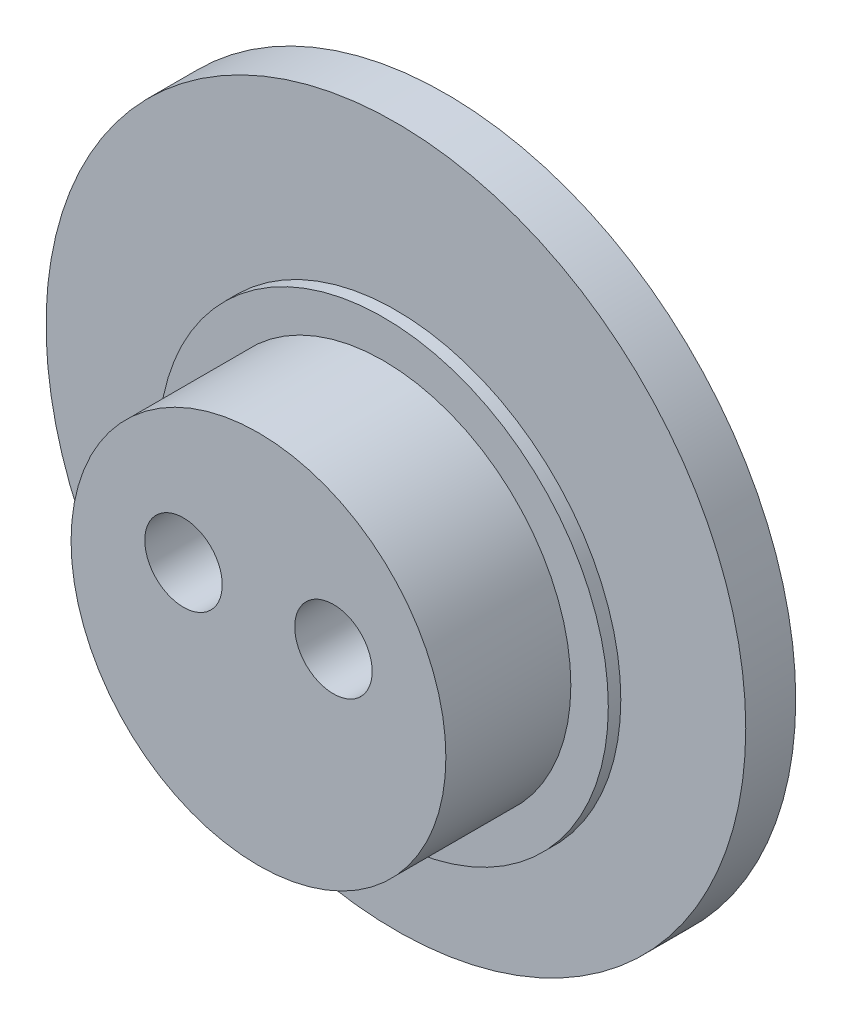
ISO-10303-21;
HEADER;
FILE_DESCRIPTION(('STEP AP214'),'2;1');
FILE_NAME('part.step','',(''),(''),'','','');
FILE_SCHEMA(('AUTOMOTIVE_DESIGN { 1 0 10303 214 1 1 1 1 }'));
ENDSEC;
DATA;
#1=APPLICATION_CONTEXT('core data for automotive mechanical design processes');
#2=APPLICATION_PROTOCOL_DEFINITION('international standard','automotive_design',2000,#1);
#3=PRODUCT_CONTEXT('',#1,'mechanical');
#4=PRODUCT('Part','Part','',(#3));
#5=PRODUCT_RELATED_PRODUCT_CATEGORY('part','',(#4));
#6=PRODUCT_DEFINITION_FORMATION('','',#4);
#7=PRODUCT_DEFINITION_CONTEXT('part definition',#1,'design');
#8=PRODUCT_DEFINITION('design','',#6,#7);
#9=PRODUCT_DEFINITION_SHAPE('','',#8);
#10=(LENGTH_UNIT() NAMED_UNIT(*) SI_UNIT(.MILLI.,.METRE.));
#11=(NAMED_UNIT(*) PLANE_ANGLE_UNIT() SI_UNIT($,.RADIAN.));
#12=(NAMED_UNIT(*) SI_UNIT($,.STERADIAN.) SOLID_ANGLE_UNIT());
#13=UNCERTAINTY_MEASURE_WITH_UNIT(LENGTH_MEASURE(1.E-05),#10,'distance_accuracy_value','');
#14=(GEOMETRIC_REPRESENTATION_CONTEXT(3) GLOBAL_UNCERTAINTY_ASSIGNED_CONTEXT((#13)) GLOBAL_UNIT_ASSIGNED_CONTEXT((#10,
#11,#12)) REPRESENTATION_CONTEXT('',''));
#15=CARTESIAN_POINT('',(0.,0.,0.));
#16=DIRECTION('',(0.,0.,1.));
#17=DIRECTION('',(1.,0.,0.));
#18=AXIS2_PLACEMENT_3D('',#15,#16,#17);
#19=CARTESIAN_POINT('',(0.,0.,2.));
#20=DIRECTION('',(0.,0.,-1.));
#21=DIRECTION('',(-1.,0.,0.));
#22=AXIS2_PLACEMENT_3D('',#19,#20,#21);
#23=CYLINDRICAL_SURFACE('',#22,14.);
#24=CARTESIAN_POINT('',(0.,0.,2.));
#25=DIRECTION('',(0.,0.,1.));
#26=DIRECTION('',(1.,0.,0.));
#27=AXIS2_PLACEMENT_3D('',#24,#25,#26);
#28=CIRCLE('',#27,14.);
#29=CARTESIAN_POINT('',(14.,0.,2.));
#30=VERTEX_POINT('',#29);
#31=EDGE_CURVE('E67',#30,#30,#28,.T.);
#32=ORIENTED_EDGE('',*,*,#31,.F.);
#33=EDGE_LOOP('',(#32));
#34=FACE_BOUND('',#33,.T.);
#35=CARTESIAN_POINT('',(0.,0.,0.));
#36=DIRECTION('',(0.,0.,1.));
#37=DIRECTION('',(1.,0.,0.));
#38=AXIS2_PLACEMENT_3D('',#35,#36,#37);
#39=CIRCLE('',#38,14.);
#40=CARTESIAN_POINT('',(14.,0.,0.));
#41=VERTEX_POINT('',#40);
#42=EDGE_CURVE('E40',#41,#41,#39,.T.);
#43=ORIENTED_EDGE('',*,*,#42,.T.);
#44=EDGE_LOOP('',(#43));
#45=FACE_BOUND('',#44,.T.);
#46=ADVANCED_FACE('F37',(#34,#45),#23,.T.);
#47=CARTESIAN_POINT('',(0.,0.,2.));
#48=DIRECTION('',(0.,0.,1.));
#49=DIRECTION('',(1.,0.,0.));
#50=AXIS2_PLACEMENT_3D('',#47,#48,#49);
#51=PLANE('',#50);
#52=CARTESIAN_POINT('',(0.,-1.5,2.));
#53=DIRECTION('',(0.,0.,1.));
#54=DIRECTION('',(1.,0.,0.));
#55=AXIS2_PLACEMENT_3D('',#52,#53,#54);
#56=CIRCLE('',#55,9.);
#57=CARTESIAN_POINT('',(9.,-1.5,2.));
#58=VERTEX_POINT('',#57);
#59=EDGE_CURVE('E51',#58,#58,#56,.T.);
#60=ORIENTED_EDGE('',*,*,#59,.F.);
#61=EDGE_LOOP('',(#60));
#62=FACE_BOUND('',#61,.T.);
#63=ORIENTED_EDGE('',*,*,#31,.T.);
#64=EDGE_LOOP('',(#63));
#65=FACE_BOUND('',#64,.T.);
#66=ADVANCED_FACE('F80',(#62,#65),#51,.T.);
#67=CARTESIAN_POINT('',(0.,0.,0.));
#68=DIRECTION('',(0.,0.,1.));
#69=DIRECTION('',(1.,0.,0.));
#70=AXIS2_PLACEMENT_3D('',#67,#68,#69);
#71=PLANE('',#70);
#72=CARTESIAN_POINT('',(0.,1.5,0.));
#73=DIRECTION('',(0.,0.,-1.));
#74=DIRECTION('',(-1.,0.,0.));
#75=AXIS2_PLACEMENT_3D('',#72,#73,#74);
#76=CIRCLE('',#75,9.);
#77=CARTESIAN_POINT('',(-9.,1.5,0.));
#78=VERTEX_POINT('',#77);
#79=EDGE_CURVE('E10',#78,#78,#76,.T.);
#80=ORIENTED_EDGE('',*,*,#79,.F.);
#81=EDGE_LOOP('',(#80));
#82=FACE_BOUND('',#81,.T.);
#83=ORIENTED_EDGE('',*,*,#42,.F.);
#84=EDGE_LOOP('',(#83));
#85=FACE_BOUND('',#84,.T.);
#86=ADVANCED_FACE('F77',(#82,#85),#71,.F.);
#87=CARTESIAN_POINT('',(0.,-1.5,2.5));
#88=DIRECTION('',(0.,0.,-1.));
#89=DIRECTION('',(-1.,0.,0.));
#90=AXIS2_PLACEMENT_3D('',#87,#88,#89);
#91=CYLINDRICAL_SURFACE('',#90,9.);
#92=CARTESIAN_POINT('',(0.,-1.5,2.5));
#93=DIRECTION('',(0.,0.,1.));
#94=DIRECTION('',(1.,0.,0.));
#95=AXIS2_PLACEMENT_3D('',#92,#93,#94);
#96=CIRCLE('',#95,9.);
#97=CARTESIAN_POINT('',(9.,-1.5,2.5));
#98=VERTEX_POINT('',#97);
#99=EDGE_CURVE('E60',#98,#98,#96,.T.);
#100=ORIENTED_EDGE('',*,*,#99,.F.);
#101=EDGE_LOOP('',(#100));
#102=FACE_BOUND('',#101,.T.);
#103=ORIENTED_EDGE('',*,*,#59,.T.);
#104=EDGE_LOOP('',(#103));
#105=FACE_BOUND('',#104,.T.);
#106=ADVANCED_FACE('F79',(#102,#105),#91,.T.);
#107=CARTESIAN_POINT('',(0.,-1.5,2.5));
#108=DIRECTION('',(0.,0.,1.));
#109=DIRECTION('',(1.,0.,0.));
#110=AXIS2_PLACEMENT_3D('',#107,#108,#109);
#111=PLANE('',#110);
#112=CARTESIAN_POINT('',(0.,-1.5,2.5));
#113=DIRECTION('',(0.,0.,1.));
#114=DIRECTION('',(1.,0.,0.));
#115=AXIS2_PLACEMENT_3D('',#112,#113,#114);
#116=CIRCLE('',#115,7.5);
#117=CARTESIAN_POINT('',(7.5,-1.5,2.5));
#118=VERTEX_POINT('',#117);
#119=EDGE_CURVE('E45',#118,#118,#116,.T.);
#120=ORIENTED_EDGE('',*,*,#119,.F.);
#121=EDGE_LOOP('',(#120));
#122=FACE_BOUND('',#121,.T.);
#123=ORIENTED_EDGE('',*,*,#99,.T.);
#124=EDGE_LOOP('',(#123));
#125=FACE_BOUND('',#124,.T.);
#126=ADVANCED_FACE('F86',(#122,#125),#111,.T.);
#127=CARTESIAN_POINT('',(0.,-1.5,7.5));
#128=DIRECTION('',(0.,0.,-1.));
#129=DIRECTION('',(-1.,0.,0.));
#130=AXIS2_PLACEMENT_3D('',#127,#128,#129);
#131=CYLINDRICAL_SURFACE('',#130,7.5);
#132=CARTESIAN_POINT('',(0.,-1.5,7.5));
#133=DIRECTION('',(0.,0.,1.));
#134=DIRECTION('',(1.,0.,0.));
#135=AXIS2_PLACEMENT_3D('',#132,#133,#134);
#136=CIRCLE('',#135,7.5);
#137=CARTESIAN_POINT('',(7.5,-1.5,7.5));
#138=VERTEX_POINT('',#137);
#139=EDGE_CURVE('E57',#138,#138,#136,.T.);
#140=ORIENTED_EDGE('',*,*,#139,.F.);
#141=EDGE_LOOP('',(#140));
#142=FACE_BOUND('',#141,.T.);
#143=ORIENTED_EDGE('',*,*,#119,.T.);
#144=EDGE_LOOP('',(#143));
#145=FACE_BOUND('',#144,.T.);
#146=ADVANCED_FACE('F115',(#142,#145),#131,.T.);
#147=CARTESIAN_POINT('',(0.,-1.5,7.5));
#148=DIRECTION('',(0.,0.,1.));
#149=DIRECTION('',(1.,0.,0.));
#150=AXIS2_PLACEMENT_3D('',#147,#148,#149);
#151=PLANE('',#150);
#152=CARTESIAN_POINT('',(3.,0.,7.5));
#153=DIRECTION('',(0.,0.,1.));
#154=DIRECTION('',(1.,0.,0.));
#155=AXIS2_PLACEMENT_3D('',#152,#153,#154);
#156=CIRCLE('',#155,1.55);
#157=CARTESIAN_POINT('',(4.55,0.,7.5));
#158=VERTEX_POINT('',#157);
#159=EDGE_CURVE('E188',#158,#158,#156,.T.);
#160=ORIENTED_EDGE('',*,*,#159,.F.);
#161=EDGE_LOOP('',(#160));
#162=FACE_BOUND('',#161,.T.);
#163=CARTESIAN_POINT('',(-3.,0.,7.5));
#164=DIRECTION('',(0.,0.,1.));
#165=DIRECTION('',(-1.,0.,0.));
#166=AXIS2_PLACEMENT_3D('',#163,#164,#165);
#167=CIRCLE('',#166,1.55);
#168=CARTESIAN_POINT('',(-4.55,0.,7.5));
#169=VERTEX_POINT('',#168);
#170=EDGE_CURVE('E196',#169,#169,#167,.T.);
#171=ORIENTED_EDGE('',*,*,#170,.F.);
#172=EDGE_LOOP('',(#171));
#173=FACE_BOUND('',#172,.T.);
#174=ORIENTED_EDGE('',*,*,#139,.T.);
#175=EDGE_LOOP('',(#174));
#176=FACE_BOUND('',#175,.T.);
#177=ADVANCED_FACE('F124',(#162,#173,#176),#151,.T.);
#178=CARTESIAN_POINT('',(0.,1.5,-0.5));
#179=DIRECTION('',(0.,0.,1.));
#180=DIRECTION('',(1.,0.,0.));
#181=AXIS2_PLACEMENT_3D('',#178,#179,#180);
#182=CYLINDRICAL_SURFACE('',#181,9.);
#183=CARTESIAN_POINT('',(0.,1.5,-0.5));
#184=DIRECTION('',(0.,0.,-1.));
#185=DIRECTION('',(-1.,0.,0.));
#186=AXIS2_PLACEMENT_3D('',#183,#184,#185);
#187=CIRCLE('',#186,9.);
#188=CARTESIAN_POINT('',(-9.,1.5,-0.5));
#189=VERTEX_POINT('',#188);
#190=EDGE_CURVE('E55',#189,#189,#187,.T.);
#191=ORIENTED_EDGE('',*,*,#190,.F.);
#192=EDGE_LOOP('',(#191));
#193=FACE_BOUND('',#192,.T.);
#194=ORIENTED_EDGE('',*,*,#79,.T.);
#195=EDGE_LOOP('',(#194));
#196=FACE_BOUND('',#195,.T.);
#197=ADVANCED_FACE('F136',(#193,#196),#182,.T.);
#198=CARTESIAN_POINT('',(0.,1.5,-0.5));
#199=DIRECTION('',(0.,0.,-1.));
#200=DIRECTION('',(-1.,0.,0.));
#201=AXIS2_PLACEMENT_3D('',#198,#199,#200);
#202=PLANE('',#201);
#203=CARTESIAN_POINT('',(3.,0.,-0.5));
#204=DIRECTION('',(0.,0.,1.));
#205=DIRECTION('',(1.,0.,0.));
#206=AXIS2_PLACEMENT_3D('',#203,#204,#205);
#207=CIRCLE('',#206,1.55);
#208=CARTESIAN_POINT('',(4.55,0.,-0.5));
#209=VERTEX_POINT('',#208);
#210=EDGE_CURVE('E185',#209,#209,#207,.T.);
#211=ORIENTED_EDGE('',*,*,#210,.T.);
#212=EDGE_LOOP('',(#211));
#213=FACE_BOUND('',#212,.T.);
#214=CARTESIAN_POINT('',(-3.,0.,-0.5));
#215=DIRECTION('',(0.,0.,1.));
#216=DIRECTION('',(-1.,0.,0.));
#217=AXIS2_PLACEMENT_3D('',#214,#215,#216);
#218=CIRCLE('',#217,1.55);
#219=CARTESIAN_POINT('',(-4.55,0.,-0.5));
#220=VERTEX_POINT('',#219);
#221=EDGE_CURVE('E190',#220,#220,#218,.T.);
#222=ORIENTED_EDGE('',*,*,#221,.T.);
#223=EDGE_LOOP('',(#222));
#224=FACE_BOUND('',#223,.T.);
#225=ORIENTED_EDGE('',*,*,#190,.T.);
#226=EDGE_LOOP('',(#225));
#227=FACE_BOUND('',#226,.T.);
#228=ADVANCED_FACE('F141',(#213,#224,#227),#202,.T.);
#229=CARTESIAN_POINT('',(-3.,0.,-0.5));
#230=DIRECTION('',(0.,0.,1.));
#231=DIRECTION('',(1.,0.,0.));
#232=AXIS2_PLACEMENT_3D('',#229,#230,#231);
#233=CYLINDRICAL_SURFACE('',#232,1.55);
#234=ORIENTED_EDGE('',*,*,#221,.F.);
#235=EDGE_LOOP('',(#234));
#236=FACE_BOUND('',#235,.T.);
#237=ORIENTED_EDGE('',*,*,#170,.T.);
#238=EDGE_LOOP('',(#237));
#239=FACE_BOUND('',#238,.T.);
#240=ADVANCED_FACE('F158',(#236,#239),#233,.F.);
#241=CARTESIAN_POINT('',(3.,0.,-0.5));
#242=DIRECTION('',(0.,0.,1.));
#243=DIRECTION('',(1.,0.,0.));
#244=AXIS2_PLACEMENT_3D('',#241,#242,#243);
#245=CYLINDRICAL_SURFACE('',#244,1.55);
#246=ORIENTED_EDGE('',*,*,#210,.F.);
#247=EDGE_LOOP('',(#246));
#248=FACE_BOUND('',#247,.T.);
#249=ORIENTED_EDGE('',*,*,#159,.T.);
#250=EDGE_LOOP('',(#249));
#251=FACE_BOUND('',#250,.T.);
#252=ADVANCED_FACE('F168',(#248,#251),#245,.F.);
#253=CLOSED_SHELL('',(#46,#66,#86,#106,#126,#146,#177,#197,#228,#240,#252));
#254=MANIFOLD_SOLID_BREP('B2',#253);
#255=ADVANCED_BREP_SHAPE_REPRESENTATION('',(#18,#254),#14);
#256=SHAPE_DEFINITION_REPRESENTATION(#9,#255);
ENDSEC;
END-ISO-10303-21;
